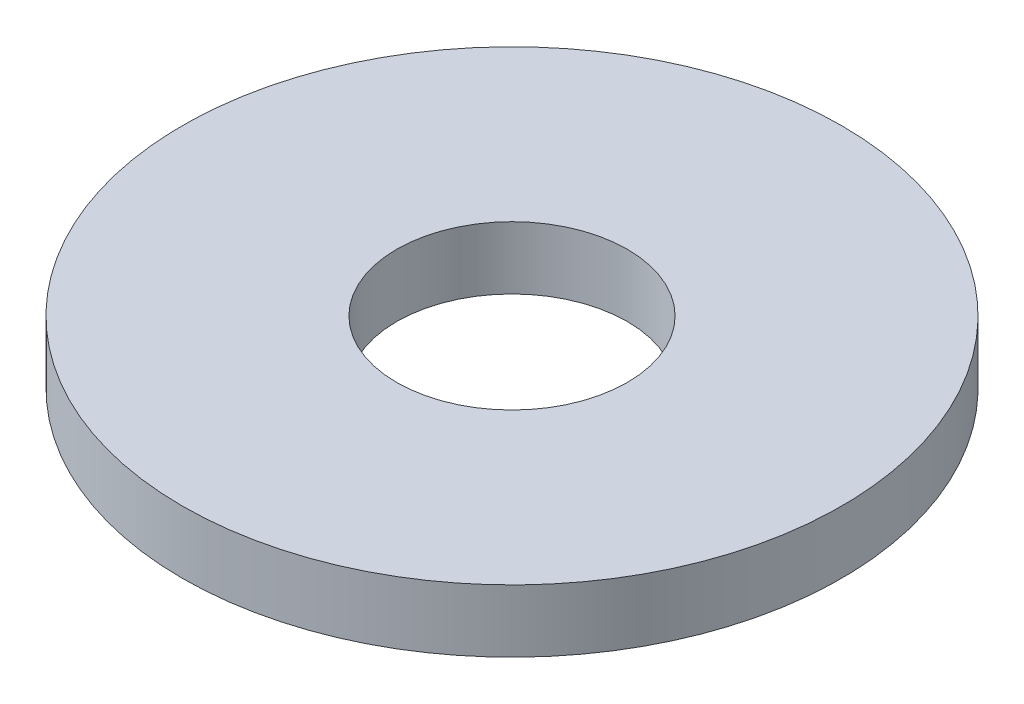
ISO-10303-21;
HEADER;
FILE_DESCRIPTION(('STEP AP214'),'2;1');
FILE_NAME('part.step','',(''),(''),'','','');
FILE_SCHEMA(('AUTOMOTIVE_DESIGN { 1 0 10303 214 1 1 1 1 }'));
ENDSEC;
DATA;
#1=APPLICATION_CONTEXT('core data for automotive mechanical design processes');
#2=APPLICATION_PROTOCOL_DEFINITION('international standard','automotive_design',2000,#1);
#3=PRODUCT_CONTEXT('',#1,'mechanical');
#4=PRODUCT('Part','Part','',(#3));
#5=PRODUCT_RELATED_PRODUCT_CATEGORY('part','',(#4));
#6=PRODUCT_DEFINITION_FORMATION('','',#4);
#7=PRODUCT_DEFINITION_CONTEXT('part definition',#1,'design');
#8=PRODUCT_DEFINITION('design','',#6,#7);
#9=PRODUCT_DEFINITION_SHAPE('','',#8);
#10=(LENGTH_UNIT() NAMED_UNIT(*) SI_UNIT(.MILLI.,.METRE.));
#11=(NAMED_UNIT(*) PLANE_ANGLE_UNIT() SI_UNIT($,.RADIAN.));
#12=(NAMED_UNIT(*) SI_UNIT($,.STERADIAN.) SOLID_ANGLE_UNIT());
#13=UNCERTAINTY_MEASURE_WITH_UNIT(LENGTH_MEASURE(1.E-05),#10,'distance_accuracy_value','');
#14=(GEOMETRIC_REPRESENTATION_CONTEXT(3) GLOBAL_UNCERTAINTY_ASSIGNED_CONTEXT((#13)) GLOBAL_UNIT_ASSIGNED_CONTEXT((#10,
#11,#12)) REPRESENTATION_CONTEXT('',''));
#15=CARTESIAN_POINT('',(0.,0.,0.));
#16=DIRECTION('',(0.,0.,1.));
#17=DIRECTION('',(1.,0.,0.));
#18=AXIS2_PLACEMENT_3D('',#15,#16,#17);
#19=CARTESIAN_POINT('',(0.,0.95,0.));
#20=DIRECTION('',(0.,1.,0.));
#21=DIRECTION('',(0.,0.,1.));
#22=AXIS2_PLACEMENT_3D('',#19,#20,#21);
#23=PLANE('',#22);
#24=CARTESIAN_POINT('',(0.,0.95,0.));
#25=DIRECTION('',(0.,1.,0.));
#26=DIRECTION('',(0.,0.,1.));
#27=AXIS2_PLACEMENT_3D('',#24,#25,#26);
#28=CIRCLE('',#27,5.);
#29=CARTESIAN_POINT('',(0.,0.95,-5.));
#30=VERTEX_POINT('',#29);
#31=EDGE_CURVE('E10',#30,#30,#28,.T.);
#32=ORIENTED_EDGE('',*,*,#31,.T.);
#33=EDGE_LOOP('',(#32));
#34=FACE_BOUND('',#33,.T.);
#35=CARTESIAN_POINT('',(0.,0.95,0.));
#36=DIRECTION('',(0.,1.,0.));
#37=DIRECTION('',(0.,0.,1.));
#38=AXIS2_PLACEMENT_3D('',#35,#36,#37);
#39=CIRCLE('',#38,1.75);
#40=CARTESIAN_POINT('',(0.,0.95,-1.75));
#41=VERTEX_POINT('',#40);
#42=EDGE_CURVE('E41',#41,#41,#39,.T.);
#43=ORIENTED_EDGE('',*,*,#42,.F.);
#44=EDGE_LOOP('',(#43));
#45=FACE_BOUND('',#44,.T.);
#46=ADVANCED_FACE('F30',(#34,#45),#23,.T.);
#47=CARTESIAN_POINT('',(0.,0.,0.));
#48=DIRECTION('',(0.,1.,0.));
#49=DIRECTION('',(0.,0.,1.));
#50=AXIS2_PLACEMENT_3D('',#47,#48,#49);
#51=PLANE('',#50);
#52=CARTESIAN_POINT('',(0.,0.,0.));
#53=DIRECTION('',(0.,1.,0.));
#54=DIRECTION('',(0.,0.,1.));
#55=AXIS2_PLACEMENT_3D('',#52,#53,#54);
#56=CIRCLE('',#55,5.);
#57=CARTESIAN_POINT('',(0.,0.,-5.));
#58=VERTEX_POINT('',#57);
#59=EDGE_CURVE('E34',#58,#58,#56,.T.);
#60=ORIENTED_EDGE('',*,*,#59,.F.);
#61=EDGE_LOOP('',(#60));
#62=FACE_BOUND('',#61,.T.);
#63=CARTESIAN_POINT('',(0.,0.,0.));
#64=DIRECTION('',(0.,1.,0.));
#65=DIRECTION('',(0.,0.,1.));
#66=AXIS2_PLACEMENT_3D('',#63,#64,#65);
#67=CIRCLE('',#66,1.75);
#68=CARTESIAN_POINT('',(0.,0.,-1.75));
#69=VERTEX_POINT('',#68);
#70=EDGE_CURVE('E43',#69,#69,#67,.T.);
#71=ORIENTED_EDGE('',*,*,#70,.T.);
#72=EDGE_LOOP('',(#71));
#73=FACE_BOUND('',#72,.T.);
#74=ADVANCED_FACE('F53',(#62,#73),#51,.F.);
#75=CARTESIAN_POINT('',(0.,0.95,0.));
#76=DIRECTION('',(0.,-1.,0.));
#77=DIRECTION('',(0.,0.,-1.));
#78=AXIS2_PLACEMENT_3D('',#75,#76,#77);
#79=CYLINDRICAL_SURFACE('',#78,5.);
#80=CARTESIAN_POINT('',(0.,0.95,-5.));
#81=CARTESIAN_POINT('',(0.,0.940104166666667,-5.));
#82=CARTESIAN_POINT('',(0.,0.930208333333333,-5.));
#83=CARTESIAN_POINT('',(0.,0.910416666666667,-5.));
#84=CARTESIAN_POINT('',(0.,0.900520833333333,-5.));
#85=CARTESIAN_POINT('',(0.,0.880729166666667,-5.));
#86=CARTESIAN_POINT('',(0.,0.870833333333333,-5.));
#87=CARTESIAN_POINT('',(0.,0.851041666666667,-5.));
#88=CARTESIAN_POINT('',(0.,0.841145833333333,-5.));
#89=CARTESIAN_POINT('',(0.,0.821354166666667,-5.));
#90=CARTESIAN_POINT('',(0.,0.811458333333333,-5.));
#91=CARTESIAN_POINT('',(0.,0.791666666666667,-5.));
#92=CARTESIAN_POINT('',(0.,0.781770833333333,-5.));
#93=CARTESIAN_POINT('',(0.,0.761979166666667,-5.));
#94=CARTESIAN_POINT('',(0.,0.752083333333333,-5.));
#95=CARTESIAN_POINT('',(0.,0.732291666666667,-5.));
#96=CARTESIAN_POINT('',(0.,0.722395833333333,-5.));
#97=CARTESIAN_POINT('',(0.,0.702604166666667,-5.));
#98=CARTESIAN_POINT('',(0.,0.692708333333333,-5.));
#99=CARTESIAN_POINT('',(0.,0.672916666666667,-5.));
#100=CARTESIAN_POINT('',(0.,0.663020833333333,-5.));
#101=CARTESIAN_POINT('',(0.,0.643229166666667,-5.));
#102=CARTESIAN_POINT('',(0.,0.633333333333333,-5.));
#103=CARTESIAN_POINT('',(0.,0.613541666666667,-5.));
#104=CARTESIAN_POINT('',(0.,0.603645833333333,-5.));
#105=CARTESIAN_POINT('',(0.,0.583854166666667,-5.));
#106=CARTESIAN_POINT('',(0.,0.573958333333333,-5.));
#107=CARTESIAN_POINT('',(0.,0.554166666666667,-5.));
#108=CARTESIAN_POINT('',(0.,0.544270833333333,-5.));
#109=CARTESIAN_POINT('',(0.,0.524479166666667,-5.));
#110=CARTESIAN_POINT('',(0.,0.514583333333333,-5.));
#111=CARTESIAN_POINT('',(0.,0.494791666666667,-5.));
#112=CARTESIAN_POINT('',(0.,0.484895833333333,-5.));
#113=CARTESIAN_POINT('',(0.,0.465104166666667,-5.));
#114=CARTESIAN_POINT('',(0.,0.455208333333333,-5.));
#115=CARTESIAN_POINT('',(0.,0.435416666666667,-5.));
#116=CARTESIAN_POINT('',(0.,0.425520833333333,-5.));
#117=CARTESIAN_POINT('',(0.,0.405729166666667,-5.));
#118=CARTESIAN_POINT('',(0.,0.395833333333333,-5.));
#119=CARTESIAN_POINT('',(0.,0.376041666666667,-5.));
#120=CARTESIAN_POINT('',(0.,0.366145833333333,-5.));
#121=CARTESIAN_POINT('',(0.,0.346354166666667,-5.));
#122=CARTESIAN_POINT('',(0.,0.336458333333333,-5.));
#123=CARTESIAN_POINT('',(0.,0.316666666666667,-5.));
#124=CARTESIAN_POINT('',(0.,0.306770833333333,-5.));
#125=CARTESIAN_POINT('',(0.,0.286979166666667,-5.));
#126=CARTESIAN_POINT('',(0.,0.277083333333333,-5.));
#127=CARTESIAN_POINT('',(0.,0.257291666666667,-5.));
#128=CARTESIAN_POINT('',(0.,0.247395833333333,-5.));
#129=CARTESIAN_POINT('',(0.,0.227604166666667,-5.));
#130=CARTESIAN_POINT('',(0.,0.217708333333333,-5.));
#131=CARTESIAN_POINT('',(0.,0.197916666666667,-5.));
#132=CARTESIAN_POINT('',(0.,0.188020833333333,-5.));
#133=CARTESIAN_POINT('',(0.,0.168229166666667,-5.));
#134=CARTESIAN_POINT('',(0.,0.158333333333333,-5.));
#135=CARTESIAN_POINT('',(0.,0.138541666666667,-5.));
#136=CARTESIAN_POINT('',(0.,0.128645833333333,-5.));
#137=CARTESIAN_POINT('',(0.,0.108854166666667,-5.));
#138=CARTESIAN_POINT('',(0.,0.0989583333333334,-5.));
#139=CARTESIAN_POINT('',(0.,0.0791666666666667,-5.));
#140=CARTESIAN_POINT('',(0.,0.0692708333333333,-5.));
#141=CARTESIAN_POINT('',(0.,0.0494791666666666,-5.));
#142=CARTESIAN_POINT('',(0.,0.0395833333333333,-5.));
#143=CARTESIAN_POINT('',(0.,0.0197916666666667,-5.));
#144=CARTESIAN_POINT('',(0.,0.00989583333333332,-5.));
#145=CARTESIAN_POINT('',(0.,0.,-5.));
#146=B_SPLINE_CURVE_WITH_KNOTS('',3,(#80,#81,#82,#83,#84,#85,#86,#87,#88,#89,#90,#91,#92,#93,
#94,#95,#96,#97,#98,#99,#100,#101,#102,#103,#104,#105,#106,#107,#108,#109,#110,#111,#112,#113,
#114,#115,#116,#117,#118,#119,#120,#121,#122,#123,#124,#125,#126,#127,#128,#129,#130,#131,#132,
#133,#134,#135,#136,#137,#138,#139,#140,#141,#142,#143,#144,#145),.UNSPECIFIED.,.F.,.F.,(4,2,2,
2,2,2,2,2,2,2,2,2,2,2,2,2,2,2,2,2,2,2,2,2,2,2,2,2,2,2,2,2,4),(0.,0.0296875000000001,
0.0593750000000001,0.0890625000000001,0.11875,0.1484375,0.178125,0.2078125,0.2375,0.2671875,
0.296875,0.3265625,0.35625,0.3859375,0.415625,0.4453125,0.475,0.5046875,0.534375,0.5640625,
0.59375,0.6234375,0.653125,0.6828125,0.7125,0.7421875,0.771875,0.8015625,0.83125,0.8609375,
0.890625,0.9203125,0.95),.UNSPECIFIED.);
#147=EDGE_CURVE('BSEAM32',#30,#58,#146,.T.);
#148=ORIENTED_EDGE('',*,*,#31,.F.);
#149=ORIENTED_EDGE('',*,*,#59,.T.);
#150=ORIENTED_EDGE('',*,*,#147,.T.);
#151=ORIENTED_EDGE('',*,*,#147,.F.);
#152=EDGE_LOOP('',(#148,#150,#149,#151));
#153=FACE_BOUND('',#152,.T.);
#154=ADVANCED_FACE('F32',(#153),#79,.T.);
#155=CARTESIAN_POINT('',(0.,0.95,0.));
#156=DIRECTION('',(0.,-1.,0.));
#157=DIRECTION('',(0.,0.,-1.));
#158=AXIS2_PLACEMENT_3D('',#155,#156,#157);
#159=CYLINDRICAL_SURFACE('',#158,1.75);
#160=CARTESIAN_POINT('',(0.,0.95,-1.75));
#161=CARTESIAN_POINT('',(0.,0.940104166666667,-1.75));
#162=CARTESIAN_POINT('',(0.,0.930208333333333,-1.75));
#163=CARTESIAN_POINT('',(0.,0.910416666666667,-1.75));
#164=CARTESIAN_POINT('',(0.,0.900520833333333,-1.75));
#165=CARTESIAN_POINT('',(0.,0.880729166666667,-1.75));
#166=CARTESIAN_POINT('',(0.,0.870833333333333,-1.75));
#167=CARTESIAN_POINT('',(0.,0.851041666666667,-1.75));
#168=CARTESIAN_POINT('',(0.,0.841145833333333,-1.75));
#169=CARTESIAN_POINT('',(0.,0.821354166666667,-1.75));
#170=CARTESIAN_POINT('',(0.,0.811458333333333,-1.75));
#171=CARTESIAN_POINT('',(0.,0.791666666666667,-1.75));
#172=CARTESIAN_POINT('',(0.,0.781770833333333,-1.75));
#173=CARTESIAN_POINT('',(0.,0.761979166666667,-1.75));
#174=CARTESIAN_POINT('',(0.,0.752083333333333,-1.75));
#175=CARTESIAN_POINT('',(0.,0.732291666666667,-1.75));
#176=CARTESIAN_POINT('',(0.,0.722395833333333,-1.75));
#177=CARTESIAN_POINT('',(0.,0.702604166666667,-1.75));
#178=CARTESIAN_POINT('',(0.,0.692708333333333,-1.75));
#179=CARTESIAN_POINT('',(0.,0.672916666666667,-1.75));
#180=CARTESIAN_POINT('',(0.,0.663020833333333,-1.75));
#181=CARTESIAN_POINT('',(0.,0.643229166666667,-1.75));
#182=CARTESIAN_POINT('',(0.,0.633333333333333,-1.75));
#183=CARTESIAN_POINT('',(0.,0.613541666666667,-1.75));
#184=CARTESIAN_POINT('',(0.,0.603645833333333,-1.75));
#185=CARTESIAN_POINT('',(0.,0.583854166666667,-1.75));
#186=CARTESIAN_POINT('',(0.,0.573958333333333,-1.75));
#187=CARTESIAN_POINT('',(0.,0.554166666666667,-1.75));
#188=CARTESIAN_POINT('',(0.,0.544270833333333,-1.75));
#189=CARTESIAN_POINT('',(0.,0.524479166666667,-1.75));
#190=CARTESIAN_POINT('',(0.,0.514583333333333,-1.75));
#191=CARTESIAN_POINT('',(0.,0.494791666666667,-1.75));
#192=CARTESIAN_POINT('',(0.,0.484895833333333,-1.75));
#193=CARTESIAN_POINT('',(0.,0.465104166666667,-1.75));
#194=CARTESIAN_POINT('',(0.,0.455208333333333,-1.75));
#195=CARTESIAN_POINT('',(0.,0.435416666666667,-1.75));
#196=CARTESIAN_POINT('',(0.,0.425520833333333,-1.75));
#197=CARTESIAN_POINT('',(0.,0.405729166666667,-1.75));
#198=CARTESIAN_POINT('',(0.,0.395833333333333,-1.75));
#199=CARTESIAN_POINT('',(0.,0.376041666666667,-1.75));
#200=CARTESIAN_POINT('',(0.,0.366145833333333,-1.75));
#201=CARTESIAN_POINT('',(0.,0.346354166666667,-1.75));
#202=CARTESIAN_POINT('',(0.,0.336458333333333,-1.75));
#203=CARTESIAN_POINT('',(0.,0.316666666666667,-1.75));
#204=CARTESIAN_POINT('',(0.,0.306770833333333,-1.75));
#205=CARTESIAN_POINT('',(0.,0.286979166666667,-1.75));
#206=CARTESIAN_POINT('',(0.,0.277083333333333,-1.75));
#207=CARTESIAN_POINT('',(0.,0.257291666666667,-1.75));
#208=CARTESIAN_POINT('',(0.,0.247395833333333,-1.75));
#209=CARTESIAN_POINT('',(0.,0.227604166666667,-1.75));
#210=CARTESIAN_POINT('',(0.,0.217708333333333,-1.75));
#211=CARTESIAN_POINT('',(0.,0.197916666666667,-1.75));
#212=CARTESIAN_POINT('',(0.,0.188020833333333,-1.75));
#213=CARTESIAN_POINT('',(0.,0.168229166666667,-1.75));
#214=CARTESIAN_POINT('',(0.,0.158333333333333,-1.75));
#215=CARTESIAN_POINT('',(0.,0.138541666666667,-1.75));
#216=CARTESIAN_POINT('',(0.,0.128645833333333,-1.75));
#217=CARTESIAN_POINT('',(0.,0.108854166666667,-1.75));
#218=CARTESIAN_POINT('',(0.,0.0989583333333334,-1.75));
#219=CARTESIAN_POINT('',(0.,0.0791666666666667,-1.75));
#220=CARTESIAN_POINT('',(0.,0.0692708333333333,-1.75));
#221=CARTESIAN_POINT('',(0.,0.0494791666666666,-1.75));
#222=CARTESIAN_POINT('',(0.,0.0395833333333333,-1.75));
#223=CARTESIAN_POINT('',(0.,0.0197916666666667,-1.75));
#224=CARTESIAN_POINT('',(0.,0.00989583333333332,-1.75));
#225=CARTESIAN_POINT('',(0.,0.,-1.75));
#226=B_SPLINE_CURVE_WITH_KNOTS('',3,(#160,#161,#162,#163,#164,#165,#166,#167,#168,#169,#170,
#171,#172,#173,#174,#175,#176,#177,#178,#179,#180,#181,#182,#183,#184,#185,#186,#187,#188,#189,
#190,#191,#192,#193,#194,#195,#196,#197,#198,#199,#200,#201,#202,#203,#204,#205,#206,#207,#208,
#209,#210,#211,#212,#213,#214,#215,#216,#217,#218,#219,#220,#221,#222,#223,#224,#225),
.UNSPECIFIED.,.F.,.F.,(4,2,2,2,2,2,2,2,2,2,2,2,2,2,2,2,2,2,2,2,2,2,2,2,2,2,2,2,2,2,2,2,4),(0.,
0.0296875000000001,0.0593750000000001,0.0890625000000001,0.11875,0.1484375,0.178125,0.2078125,
0.2375,0.2671875,0.296875,0.3265625,0.35625,0.3859375,0.415625,0.4453125,0.475,0.5046875,
0.534375,0.5640625,0.59375,0.6234375,0.653125,0.6828125,0.7125,0.7421875,0.771875,0.8015625,
0.83125,0.8609375,0.890625,0.9203125,0.95),.UNSPECIFIED.);
#227=EDGE_CURVE('BSEAM49',#41,#69,#226,.T.);
#228=ORIENTED_EDGE('',*,*,#42,.T.);
#229=ORIENTED_EDGE('',*,*,#70,.F.);
#230=ORIENTED_EDGE('',*,*,#227,.T.);
#231=ORIENTED_EDGE('',*,*,#227,.F.);
#232=EDGE_LOOP('',(#228,#230,#229,#231));
#233=FACE_BOUND('',#232,.T.);
#234=ADVANCED_FACE('F49',(#233),#159,.F.);
#235=CLOSED_SHELL('',(#46,#74,#154,#234));
#236=MANIFOLD_SOLID_BREP('B2',#235);
#237=ADVANCED_BREP_SHAPE_REPRESENTATION('',(#18,#236),#14);
#238=SHAPE_DEFINITION_REPRESENTATION(#9,#237);
ENDSEC;
END-ISO-10303-21;
